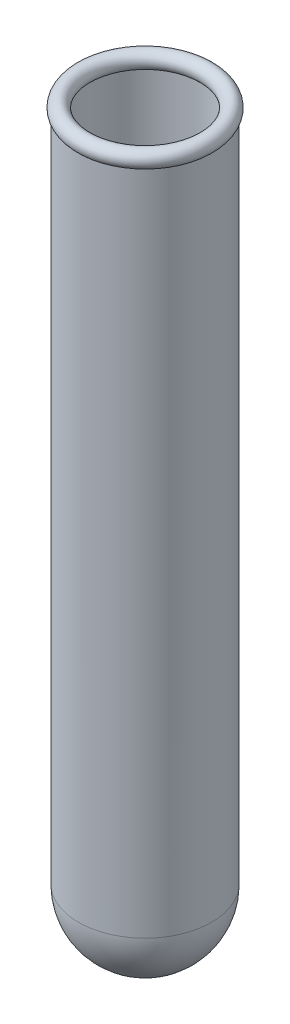
ISO-10303-21;
HEADER;
FILE_DESCRIPTION(('STEP AP214'),'2;1');
FILE_NAME('part.step','',(''),(''),'','','');
FILE_SCHEMA(('AUTOMOTIVE_DESIGN { 1 0 10303 214 1 1 1 1 }'));
ENDSEC;
DATA;
#1=APPLICATION_CONTEXT('core data for automotive mechanical design processes');
#2=APPLICATION_PROTOCOL_DEFINITION('international standard','automotive_design',2000,#1);
#3=PRODUCT_CONTEXT('',#1,'mechanical');
#4=PRODUCT('Part','Part','',(#3));
#5=PRODUCT_RELATED_PRODUCT_CATEGORY('part','',(#4));
#6=PRODUCT_DEFINITION_FORMATION('','',#4);
#7=PRODUCT_DEFINITION_CONTEXT('part definition',#1,'design');
#8=PRODUCT_DEFINITION('design','',#6,#7);
#9=PRODUCT_DEFINITION_SHAPE('','',#8);
#10=(LENGTH_UNIT() NAMED_UNIT(*) SI_UNIT(.MILLI.,.METRE.));
#11=(NAMED_UNIT(*) PLANE_ANGLE_UNIT() SI_UNIT($,.RADIAN.));
#12=(NAMED_UNIT(*) SI_UNIT($,.STERADIAN.) SOLID_ANGLE_UNIT());
#13=UNCERTAINTY_MEASURE_WITH_UNIT(LENGTH_MEASURE(1.E-05),#10,'distance_accuracy_value','');
#14=(GEOMETRIC_REPRESENTATION_CONTEXT(3) GLOBAL_UNCERTAINTY_ASSIGNED_CONTEXT((#13)) GLOBAL_UNIT_ASSIGNED_CONTEXT((#10,
#11,#12)) REPRESENTATION_CONTEXT('',''));
#15=CARTESIAN_POINT('',(0.,0.,0.));
#16=DIRECTION('',(0.,0.,1.));
#17=DIRECTION('',(1.,0.,0.));
#18=AXIS2_PLACEMENT_3D('',#15,#16,#17);
#19=CARTESIAN_POINT('',(0.,60.5590169943749,0.));
#20=DIRECTION('',(0.,-1.,0.));
#21=DIRECTION('',(0.,0.,-1.));
#22=AXIS2_PLACEMENT_3D('',#19,#20,#21);
#23=TOROIDAL_SURFACE('',#22,5.5,0.749999999999999);
#24=CARTESIAN_POINT('',(0.,60.,0.));
#25=DIRECTION('',(0.,-1.,0.));
#26=DIRECTION('',(0.,0.,-1.));
#27=AXIS2_PLACEMENT_3D('',#24,#25,#26);
#28=CIRCLE('',#27,5.);
#29=CARTESIAN_POINT('',(0.,60.,-5.));
#30=VERTEX_POINT('',#29);
#31=EDGE_CURVE('E10',#30,#30,#28,.T.);
#32=ORIENTED_EDGE('',*,*,#31,.T.);
#33=EDGE_LOOP('',(#32));
#34=FACE_BOUND('',#33,.T.);
#35=CARTESIAN_POINT('',(0.,60.,0.));
#36=DIRECTION('',(0.,-1.,0.));
#37=DIRECTION('',(0.,0.,-1.));
#38=AXIS2_PLACEMENT_3D('',#35,#36,#37);
#39=CIRCLE('',#38,6.);
#40=CARTESIAN_POINT('',(0.,60.,-6.));
#41=VERTEX_POINT('',#40);
#42=EDGE_CURVE('E47',#41,#41,#39,.T.);
#43=ORIENTED_EDGE('',*,*,#42,.F.);
#44=EDGE_LOOP('',(#43));
#45=FACE_BOUND('',#44,.T.);
#46=ADVANCED_FACE('F33',(#34,#45),#23,.T.);
#47=CARTESIAN_POINT('',(0.,0.,0.));
#48=DIRECTION('',(0.,-1.,0.));
#49=DIRECTION('',(0.,0.,-1.));
#50=AXIS2_PLACEMENT_3D('',#47,#48,#49);
#51=CYLINDRICAL_SURFACE('',#50,5.);
#52=ORIENTED_EDGE('',*,*,#31,.F.);
#53=EDGE_LOOP('',(#52));
#54=FACE_BOUND('',#53,.T.);
#55=CARTESIAN_POINT('',(0.,0.,0.));
#56=DIRECTION('',(0.,-1.,0.));
#57=DIRECTION('',(0.,0.,-1.));
#58=AXIS2_PLACEMENT_3D('',#55,#56,#57);
#59=CIRCLE('',#58,5.);
#60=CARTESIAN_POINT('',(0.,0.,-5.));
#61=VERTEX_POINT('',#60);
#62=EDGE_CURVE('E39',#61,#61,#59,.T.);
#63=ORIENTED_EDGE('',*,*,#62,.T.);
#64=EDGE_LOOP('',(#63));
#65=FACE_BOUND('',#64,.T.);
#66=ADVANCED_FACE('F57',(#54,#65),#51,.F.);
#67=CARTESIAN_POINT('',(0.,0.,0.));
#68=DIRECTION('',(0.,-1.,0.));
#69=DIRECTION('',(-1.,0.,0.));
#70=AXIS2_PLACEMENT_3D('',#67,#68,#69);
#71=SPHERICAL_SURFACE('',#70,5.);
#72=ORIENTED_EDGE('',*,*,#62,.F.);
#73=EDGE_LOOP('',(#72));
#74=FACE_BOUND('',#73,.T.);
#75=ADVANCED_FACE('F61',(#74),#71,.F.);
#76=CARTESIAN_POINT('',(0.,0.,0.));
#77=DIRECTION('',(0.,-1.,0.));
#78=DIRECTION('',(-1.,0.,0.));
#79=AXIS2_PLACEMENT_3D('',#76,#77,#78);
#80=SPHERICAL_SURFACE('',#79,6.);
#81=CARTESIAN_POINT('',(0.,0.,0.));
#82=DIRECTION('',(0.,-1.,0.));
#83=DIRECTION('',(0.,0.,-1.));
#84=AXIS2_PLACEMENT_3D('',#81,#82,#83);
#85=CIRCLE('',#84,6.);
#86=CARTESIAN_POINT('',(0.,0.,-6.));
#87=VERTEX_POINT('',#86);
#88=EDGE_CURVE('E43',#87,#87,#85,.T.);
#89=ORIENTED_EDGE('',*,*,#88,.T.);
#90=EDGE_LOOP('',(#89));
#91=FACE_BOUND('',#90,.T.);
#92=ADVANCED_FACE('F66',(#91),#80,.T.);
#93=CARTESIAN_POINT('',(0.,0.,0.));
#94=DIRECTION('',(0.,-1.,0.));
#95=DIRECTION('',(0.,0.,-1.));
#96=AXIS2_PLACEMENT_3D('',#93,#94,#95);
#97=CYLINDRICAL_SURFACE('',#96,6.);
#98=ORIENTED_EDGE('',*,*,#42,.T.);
#99=EDGE_LOOP('',(#98));
#100=FACE_BOUND('',#99,.T.);
#101=ORIENTED_EDGE('',*,*,#88,.F.);
#102=EDGE_LOOP('',(#101));
#103=FACE_BOUND('',#102,.T.);
#104=ADVANCED_FACE('F53',(#100,#103),#97,.T.);
#105=CLOSED_SHELL('',(#46,#66,#75,#92,#104));
#106=MANIFOLD_SOLID_BREP('B2',#105);
#107=ADVANCED_BREP_SHAPE_REPRESENTATION('',(#18,#106),#14);
#108=SHAPE_DEFINITION_REPRESENTATION(#9,#107);
ENDSEC;
END-ISO-10303-21;
